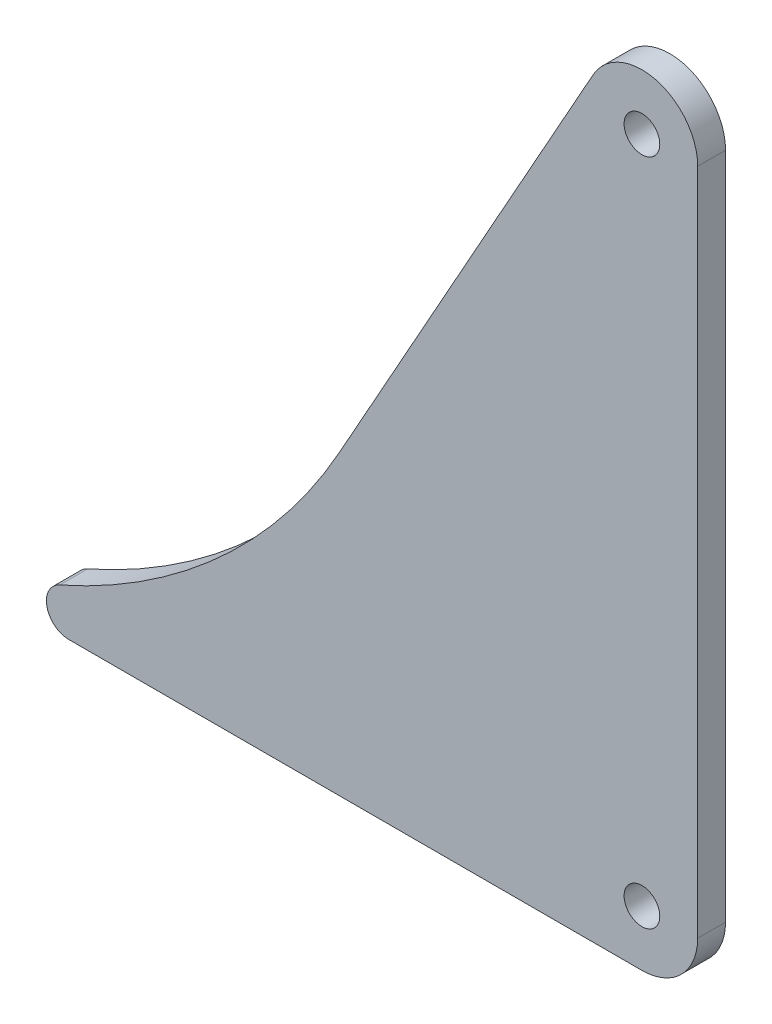
ISO-10303-21;
HEADER;
FILE_DESCRIPTION(('STEP AP214'),'2;1');
FILE_NAME('part.step','',(''),(''),'','','');
FILE_SCHEMA(('AUTOMOTIVE_DESIGN { 1 0 10303 214 1 1 1 1 }'));
ENDSEC;
DATA;
#1=APPLICATION_CONTEXT('core data for automotive mechanical design processes');
#2=APPLICATION_PROTOCOL_DEFINITION('international standard','automotive_design',2000,#1);
#3=PRODUCT_CONTEXT('',#1,'mechanical');
#4=PRODUCT('Part','Part','',(#3));
#5=PRODUCT_RELATED_PRODUCT_CATEGORY('part','',(#4));
#6=PRODUCT_DEFINITION_FORMATION('','',#4);
#7=PRODUCT_DEFINITION_CONTEXT('part definition',#1,'design');
#8=PRODUCT_DEFINITION('design','',#6,#7);
#9=PRODUCT_DEFINITION_SHAPE('','',#8);
#10=(LENGTH_UNIT() NAMED_UNIT(*) SI_UNIT(.MILLI.,.METRE.));
#11=(NAMED_UNIT(*) PLANE_ANGLE_UNIT() SI_UNIT($,.RADIAN.));
#12=(NAMED_UNIT(*) SI_UNIT($,.STERADIAN.) SOLID_ANGLE_UNIT());
#13=UNCERTAINTY_MEASURE_WITH_UNIT(LENGTH_MEASURE(1.E-05),#10,'distance_accuracy_value','');
#14=(GEOMETRIC_REPRESENTATION_CONTEXT(3) GLOBAL_UNCERTAINTY_ASSIGNED_CONTEXT((#13)) GLOBAL_UNIT_ASSIGNED_CONTEXT((#10,
#11,#12)) REPRESENTATION_CONTEXT('',''));
#15=CARTESIAN_POINT('',(0.,0.,0.));
#16=DIRECTION('',(0.,0.,1.));
#17=DIRECTION('',(1.,0.,0.));
#18=AXIS2_PLACEMENT_3D('',#15,#16,#17);
#19=CARTESIAN_POINT('',(0.,0.,3.175));
#20=DIRECTION('',(0.,1.,0.));
#21=DIRECTION('',(-1.,0.,0.));
#22=AXIS2_PLACEMENT_3D('',#19,#20,#21);
#23=PLANE('',#22);
#24=DIRECTION('',(1.,0.,0.));
#25=VECTOR('',#24,1.);
#26=CARTESIAN_POINT('',(0.,0.,0.));
#27=LINE('',#26,#25);
#28=CARTESIAN_POINT('',(-71.637195746677,0.,0.));
#29=VERTEX_POINT('',#28);
#30=CARTESIAN_POINT('',(-6.35,0.,0.));
#31=VERTEX_POINT('',#30);
#32=EDGE_CURVE('E149',#29,#31,#27,.T.);
#33=ORIENTED_EDGE('',*,*,#32,.T.);
#34=DIRECTION('',(0.,0.,-1.));
#35=VECTOR('',#34,1.);
#36=CARTESIAN_POINT('',(-6.35,0.,3.175));
#37=LINE('',#36,#35);
#38=CARTESIAN_POINT('',(-6.35,0.,3.175));
#39=VERTEX_POINT('',#38);
#40=EDGE_CURVE('E78',#31,#39,#37,.F.);
#41=ORIENTED_EDGE('',*,*,#40,.T.);
#42=DIRECTION('',(1.,0.,0.));
#43=VECTOR('',#42,1.);
#44=CARTESIAN_POINT('',(0.,0.,3.175));
#45=LINE('',#44,#43);
#46=CARTESIAN_POINT('',(-71.637195746677,0.,3.175));
#47=VERTEX_POINT('',#46);
#48=EDGE_CURVE('E161',#47,#39,#45,.T.);
#49=ORIENTED_EDGE('',*,*,#48,.F.);
#50=DIRECTION('',(0.,0.,-1.));
#51=VECTOR('',#50,1.);
#52=CARTESIAN_POINT('',(-71.637195746677,0.,3.175));
#53=LINE('',#52,#51);
#54=EDGE_CURVE('E140',#47,#29,#53,.T.);
#55=ORIENTED_EDGE('',*,*,#54,.T.);
#56=EDGE_LOOP('',(#33,#41,#49,#55));
#57=FACE_BOUND('',#56,.T.);
#58=ADVANCED_FACE('F51',(#57),#23,.F.);
#59=CARTESIAN_POINT('',(0.,0.,3.175));
#60=DIRECTION('',(-1.,0.,0.));
#61=DIRECTION('',(0.,-1.,0.));
#62=AXIS2_PLACEMENT_3D('',#59,#60,#61);
#63=PLANE('',#62);
#64=DIRECTION('',(0.,1.,0.));
#65=VECTOR('',#64,1.);
#66=CARTESIAN_POINT('',(0.,0.,3.175));
#67=LINE('',#66,#65);
#68=CARTESIAN_POINT('',(0.,6.35,3.175));
#69=VERTEX_POINT('',#68);
#70=CARTESIAN_POINT('',(0.,82.4979448823979,3.175));
#71=VERTEX_POINT('',#70);
#72=EDGE_CURVE('E129',#69,#71,#67,.T.);
#73=ORIENTED_EDGE('',*,*,#72,.F.);
#74=DIRECTION('',(0.,0.,-1.));
#75=VECTOR('',#74,1.);
#76=CARTESIAN_POINT('',(0.,6.35,3.175));
#77=LINE('',#76,#75);
#78=CARTESIAN_POINT('',(0.,6.35,0.));
#79=VERTEX_POINT('',#78);
#80=EDGE_CURVE('E177',#69,#79,#77,.T.);
#81=ORIENTED_EDGE('',*,*,#80,.T.);
#82=DIRECTION('',(0.,1.,0.));
#83=VECTOR('',#82,1.);
#84=CARTESIAN_POINT('',(0.,0.,0.));
#85=LINE('',#84,#83);
#86=CARTESIAN_POINT('',(0.,82.4979448823979,0.));
#87=VERTEX_POINT('',#86);
#88=EDGE_CURVE('E152',#79,#87,#85,.T.);
#89=ORIENTED_EDGE('',*,*,#88,.T.);
#90=DIRECTION('',(0.,0.,-1.));
#91=VECTOR('',#90,1.);
#92=CARTESIAN_POINT('',(0.,82.4979448823979,3.175));
#93=LINE('',#92,#91);
#94=EDGE_CURVE('E174',#87,#71,#93,.F.);
#95=ORIENTED_EDGE('',*,*,#94,.T.);
#96=EDGE_LOOP('',(#73,#81,#89,#95));
#97=FACE_BOUND('',#96,.T.);
#98=ADVANCED_FACE('F196',(#97),#63,.F.);
#99=CARTESIAN_POINT('',(0.,106.872811365706,3.175));
#100=DIRECTION('',(0.872891230138975,-0.487914849483459,0.));
#101=DIRECTION('',(0.487914849483459,0.872891230138975,0.));
#102=AXIS2_PLACEMENT_3D('',#99,#100,#101);
#103=PLANE('',#102);
#104=DIRECTION('',(-0.487914849483459,-0.872891230138975,0.));
#105=VECTOR('',#104,1.);
#106=CARTESIAN_POINT('',(0.,106.872811365706,3.175));
#107=LINE('',#106,#105);
#108=CARTESIAN_POINT('',(-11.8928593113825,85.5962041766179,3.175));
#109=VERTEX_POINT('',#108);
#110=CARTESIAN_POINT('',(-40.8069996400724,33.8681218142123,3.175));
#111=VERTEX_POINT('',#110);
#112=EDGE_CURVE('E120',#109,#111,#107,.T.);
#113=ORIENTED_EDGE('',*,*,#112,.F.);
#114=DIRECTION('',(0.,0.,-1.));
#115=VECTOR('',#114,1.);
#116=CARTESIAN_POINT('',(-11.8928593113825,85.5962041766179,3.175));
#117=LINE('',#116,#115);
#118=CARTESIAN_POINT('',(-11.8928593113825,85.5962041766179,0.));
#119=VERTEX_POINT('',#118);
#120=EDGE_CURVE('E11',#109,#119,#117,.T.);
#121=ORIENTED_EDGE('',*,*,#120,.T.);
#122=DIRECTION('',(-0.487914849483459,-0.872891230138975,0.));
#123=VECTOR('',#122,1.);
#124=CARTESIAN_POINT('',(0.,106.872811365706,0.));
#125=LINE('',#124,#123);
#126=CARTESIAN_POINT('',(-40.8069996400724,33.8681218142123,0.));
#127=VERTEX_POINT('',#126);
#128=EDGE_CURVE('E135',#119,#127,#125,.T.);
#129=ORIENTED_EDGE('',*,*,#128,.T.);
#130=DIRECTION('',(0.,0.,-1.));
#131=VECTOR('',#130,1.);
#132=CARTESIAN_POINT('',(-40.8069996400724,33.8681218142123,3.175));
#133=LINE('',#132,#131);
#134=EDGE_CURVE('E132',#111,#127,#133,.T.);
#135=ORIENTED_EDGE('',*,*,#134,.F.);
#136=EDGE_LOOP('',(#113,#121,#129,#135));
#137=FACE_BOUND('',#136,.T.);
#138=ADVANCED_FACE('F133',(#137),#103,.F.);
#139=CARTESIAN_POINT('',(-100.130672302266,67.0279243398624,3.175));
#140=DIRECTION('',(0.,0.,-1.));
#141=DIRECTION('',(-1.,0.,0.));
#142=AXIS2_PLACEMENT_3D('',#139,#140,#141);
#143=CYLINDRICAL_SURFACE('',#142,67.9622736646679);
#144=CARTESIAN_POINT('',(-100.130672302266,67.0279243398624,0.));
#145=DIRECTION('',(0.,0.,-1.));
#146=DIRECTION('',(1.,0.,0.));
#147=AXIS2_PLACEMENT_3D('',#144,#145,#146);
#148=CIRCLE('',#147,67.9622736646679);
#149=CARTESIAN_POINT('',(-72.6637361217496,4.8633197925266,0.));
#150=VERTEX_POINT('',#149);
#151=EDGE_CURVE('E159',#127,#150,#148,.T.);
#152=ORIENTED_EDGE('',*,*,#151,.T.);
#153=DIRECTION('',(0.,0.,-1.));
#154=VECTOR('',#153,1.);
#155=CARTESIAN_POINT('',(-72.6637361217496,4.8633197925266,3.175));
#156=LINE('',#155,#154);
#157=CARTESIAN_POINT('',(-72.6637361217496,4.8633197925266,3.175));
#158=VERTEX_POINT('',#157);
#159=EDGE_CURVE('E144',#150,#158,#156,.F.);
#160=ORIENTED_EDGE('',*,*,#159,.T.);
#161=CARTESIAN_POINT('',(-100.130672302266,67.0279243398624,3.175));
#162=DIRECTION('',(0.,0.,-1.));
#163=DIRECTION('',(1.,0.,0.));
#164=AXIS2_PLACEMENT_3D('',#161,#162,#163);
#165=CIRCLE('',#164,67.9622736646679);
#166=EDGE_CURVE('E124',#111,#158,#165,.T.);
#167=ORIENTED_EDGE('',*,*,#166,.F.);
#168=ORIENTED_EDGE('',*,*,#134,.T.);
#169=EDGE_LOOP('',(#152,#160,#167,#168));
#170=FACE_BOUND('',#169,.T.);
#171=ADVANCED_FACE('F142',(#170),#143,.F.);
#172=CARTESIAN_POINT('',(-100.130672302266,67.0279243398624,3.175));
#173=DIRECTION('',(0.,0.,1.));
#174=DIRECTION('',(1.,0.,0.));
#175=AXIS2_PLACEMENT_3D('',#172,#173,#174);
#176=PLANE('',#175);
#177=CARTESIAN_POINT('',(-6.35,6.35,3.175));
#178=DIRECTION('',(0.,0.,1.));
#179=DIRECTION('',(1.,0.,0.));
#180=AXIS2_PLACEMENT_3D('',#177,#178,#179);
#181=CIRCLE('',#180,2.032);
#182=CARTESIAN_POINT('',(-4.318,6.35,3.175));
#183=VERTEX_POINT('',#182);
#184=EDGE_CURVE('E314',#183,#183,#181,.T.);
#185=ORIENTED_EDGE('',*,*,#184,.F.);
#186=EDGE_LOOP('',(#185));
#187=FACE_BOUND('',#186,.T.);
#188=CARTESIAN_POINT('',(-6.35,82.4979448823979,3.175));
#189=DIRECTION('',(0.,0.,1.));
#190=DIRECTION('',(1.,0.,0.));
#191=AXIS2_PLACEMENT_3D('',#188,#189,#190);
#192=CIRCLE('',#191,2.03200000000001);
#193=CARTESIAN_POINT('',(-4.31799999999999,82.4979448823979,3.175));
#194=VERTEX_POINT('',#193);
#195=EDGE_CURVE('E316',#194,#194,#192,.T.);
#196=ORIENTED_EDGE('',*,*,#195,.F.);
#197=EDGE_LOOP('',(#196));
#198=FACE_BOUND('',#197,.T.);
#199=ORIENTED_EDGE('',*,*,#48,.T.);
#200=CARTESIAN_POINT('',(-6.35,6.35,3.175));
#201=DIRECTION('',(0.,0.,1.));
#202=DIRECTION('',(1.,0.,0.));
#203=AXIS2_PLACEMENT_3D('',#200,#201,#202);
#204=CIRCLE('',#203,6.35);
#205=EDGE_CURVE('E60',#39,#69,#204,.T.);
#206=ORIENTED_EDGE('',*,*,#205,.T.);
#207=ORIENTED_EDGE('',*,*,#72,.T.);
#208=CARTESIAN_POINT('',(-6.35,82.4979448823979,3.175));
#209=DIRECTION('',(0.,0.,1.));
#210=DIRECTION('',(1.,0.,0.));
#211=AXIS2_PLACEMENT_3D('',#208,#209,#210);
#212=CIRCLE('',#211,6.35);
#213=EDGE_CURVE('E70',#71,#109,#212,.T.);
#214=ORIENTED_EDGE('',*,*,#213,.T.);
#215=ORIENTED_EDGE('',*,*,#112,.T.);
#216=ORIENTED_EDGE('',*,*,#166,.T.);
#217=CARTESIAN_POINT('',(-71.637195746677,2.53999999999999,3.175));
#218=DIRECTION('',(0.,0.,1.));
#219=DIRECTION('',(1.,0.,0.));
#220=AXIS2_PLACEMENT_3D('',#217,#218,#219);
#221=CIRCLE('',#220,2.54);
#222=EDGE_CURVE('E171',#158,#47,#221,.T.);
#223=ORIENTED_EDGE('',*,*,#222,.T.);
#224=EDGE_LOOP('',(#199,#206,#207,#214,#215,#216,#223));
#225=FACE_BOUND('',#224,.T.);
#226=ADVANCED_FACE('F122',(#187,#198,#225),#176,.T.);
#227=CARTESIAN_POINT('',(-100.130672302266,67.0279243398624,0.));
#228=DIRECTION('',(0.,0.,1.));
#229=DIRECTION('',(1.,0.,0.));
#230=AXIS2_PLACEMENT_3D('',#227,#228,#229);
#231=PLANE('',#230);
#232=CARTESIAN_POINT('',(-6.35,6.35,0.));
#233=DIRECTION('',(0.,0.,1.));
#234=DIRECTION('',(1.,0.,0.));
#235=AXIS2_PLACEMENT_3D('',#232,#233,#234);
#236=CIRCLE('',#235,2.032);
#237=CARTESIAN_POINT('',(-4.318,6.35,0.));
#238=VERTEX_POINT('',#237);
#239=EDGE_CURVE('E153',#238,#238,#236,.T.);
#240=ORIENTED_EDGE('',*,*,#239,.T.);
#241=EDGE_LOOP('',(#240));
#242=FACE_BOUND('',#241,.T.);
#243=CARTESIAN_POINT('',(-6.35,82.4979448823979,0.));
#244=DIRECTION('',(0.,0.,1.));
#245=DIRECTION('',(1.,0.,0.));
#246=AXIS2_PLACEMENT_3D('',#243,#244,#245);
#247=CIRCLE('',#246,2.03200000000001);
#248=CARTESIAN_POINT('',(-4.31799999999999,82.4979448823979,0.));
#249=VERTEX_POINT('',#248);
#250=EDGE_CURVE('E322',#249,#249,#247,.T.);
#251=ORIENTED_EDGE('',*,*,#250,.T.);
#252=EDGE_LOOP('',(#251));
#253=FACE_BOUND('',#252,.T.);
#254=ORIENTED_EDGE('',*,*,#88,.F.);
#255=CARTESIAN_POINT('',(-6.35,6.35,0.));
#256=DIRECTION('',(0.,0.,1.));
#257=DIRECTION('',(1.,0.,0.));
#258=AXIS2_PLACEMENT_3D('',#255,#256,#257);
#259=CIRCLE('',#258,6.35);
#260=EDGE_CURVE('E184',#79,#31,#259,.F.);
#261=ORIENTED_EDGE('',*,*,#260,.T.);
#262=ORIENTED_EDGE('',*,*,#32,.F.);
#263=CARTESIAN_POINT('',(-71.637195746677,2.53999999999999,0.));
#264=DIRECTION('',(0.,0.,1.));
#265=DIRECTION('',(1.,0.,0.));
#266=AXIS2_PLACEMENT_3D('',#263,#264,#265);
#267=CIRCLE('',#266,2.54);
#268=EDGE_CURVE('E166',#29,#150,#267,.F.);
#269=ORIENTED_EDGE('',*,*,#268,.T.);
#270=ORIENTED_EDGE('',*,*,#151,.F.);
#271=ORIENTED_EDGE('',*,*,#128,.F.);
#272=CARTESIAN_POINT('',(-6.35,82.4979448823979,0.));
#273=DIRECTION('',(0.,0.,1.));
#274=DIRECTION('',(1.,0.,0.));
#275=AXIS2_PLACEMENT_3D('',#272,#273,#274);
#276=CIRCLE('',#275,6.35);
#277=EDGE_CURVE('E181',#119,#87,#276,.F.);
#278=ORIENTED_EDGE('',*,*,#277,.T.);
#279=EDGE_LOOP('',(#254,#261,#262,#269,#270,#271,#278));
#280=FACE_BOUND('',#279,.T.);
#281=ADVANCED_FACE('F203',(#242,#253,#280),#231,.F.);
#282=CARTESIAN_POINT('',(-71.637195746677,2.53999999999999,3.175));
#283=DIRECTION('',(0.,0.,-1.));
#284=DIRECTION('',(-1.,0.,0.));
#285=AXIS2_PLACEMENT_3D('',#282,#283,#284);
#286=CYLINDRICAL_SURFACE('',#285,2.54);
#287=ORIENTED_EDGE('',*,*,#222,.F.);
#288=ORIENTED_EDGE('',*,*,#159,.F.);
#289=ORIENTED_EDGE('',*,*,#268,.F.);
#290=ORIENTED_EDGE('',*,*,#54,.F.);
#291=EDGE_LOOP('',(#287,#288,#289,#290));
#292=FACE_BOUND('',#291,.T.);
#293=ADVANCED_FACE('F206',(#292),#286,.T.);
#294=CARTESIAN_POINT('',(-6.35,6.35,3.175));
#295=DIRECTION('',(0.,0.,-1.));
#296=DIRECTION('',(-1.,0.,0.));
#297=AXIS2_PLACEMENT_3D('',#294,#295,#296);
#298=CYLINDRICAL_SURFACE('',#297,6.35);
#299=ORIENTED_EDGE('',*,*,#205,.F.);
#300=ORIENTED_EDGE('',*,*,#40,.F.);
#301=ORIENTED_EDGE('',*,*,#260,.F.);
#302=ORIENTED_EDGE('',*,*,#80,.F.);
#303=EDGE_LOOP('',(#299,#300,#301,#302));
#304=FACE_BOUND('',#303,.T.);
#305=ADVANCED_FACE('F200',(#304),#298,.T.);
#306=CARTESIAN_POINT('',(-6.35,82.4979448823979,3.175));
#307=DIRECTION('',(0.,0.,-1.));
#308=DIRECTION('',(-1.,0.,0.));
#309=AXIS2_PLACEMENT_3D('',#306,#307,#308);
#310=CYLINDRICAL_SURFACE('',#309,6.35);
#311=ORIENTED_EDGE('',*,*,#213,.F.);
#312=ORIENTED_EDGE('',*,*,#94,.F.);
#313=ORIENTED_EDGE('',*,*,#277,.F.);
#314=ORIENTED_EDGE('',*,*,#120,.F.);
#315=EDGE_LOOP('',(#311,#312,#313,#314));
#316=FACE_BOUND('',#315,.T.);
#317=ADVANCED_FACE('F53',(#316),#310,.T.);
#318=CARTESIAN_POINT('',(-6.35,82.4979448823979,0.));
#319=DIRECTION('',(0.,0.,1.));
#320=DIRECTION('',(1.,0.,0.));
#321=AXIS2_PLACEMENT_3D('',#318,#319,#320);
#322=CYLINDRICAL_SURFACE('',#321,2.03200000000001);
#323=ORIENTED_EDGE('',*,*,#250,.F.);
#324=EDGE_LOOP('',(#323));
#325=FACE_BOUND('',#324,.T.);
#326=ORIENTED_EDGE('',*,*,#195,.T.);
#327=EDGE_LOOP('',(#326));
#328=FACE_BOUND('',#327,.T.);
#329=ADVANCED_FACE('F209',(#325,#328),#322,.F.);
#330=CARTESIAN_POINT('',(-6.35,6.35,0.));
#331=DIRECTION('',(0.,0.,1.));
#332=DIRECTION('',(1.,0.,0.));
#333=AXIS2_PLACEMENT_3D('',#330,#331,#332);
#334=CYLINDRICAL_SURFACE('',#333,2.032);
#335=ORIENTED_EDGE('',*,*,#239,.F.);
#336=EDGE_LOOP('',(#335));
#337=FACE_BOUND('',#336,.T.);
#338=ORIENTED_EDGE('',*,*,#184,.T.);
#339=EDGE_LOOP('',(#338));
#340=FACE_BOUND('',#339,.T.);
#341=ADVANCED_FACE('F215',(#337,#340),#334,.F.);
#342=CLOSED_SHELL('',(#58,#98,#138,#171,#226,#281,#293,#305,#317,#329,#341));
#343=MANIFOLD_SOLID_BREP('B2',#342);
#344=ADVANCED_BREP_SHAPE_REPRESENTATION('',(#18,#343),#14);
#345=SHAPE_DEFINITION_REPRESENTATION(#9,#344);
ENDSEC;
END-ISO-10303-21;
